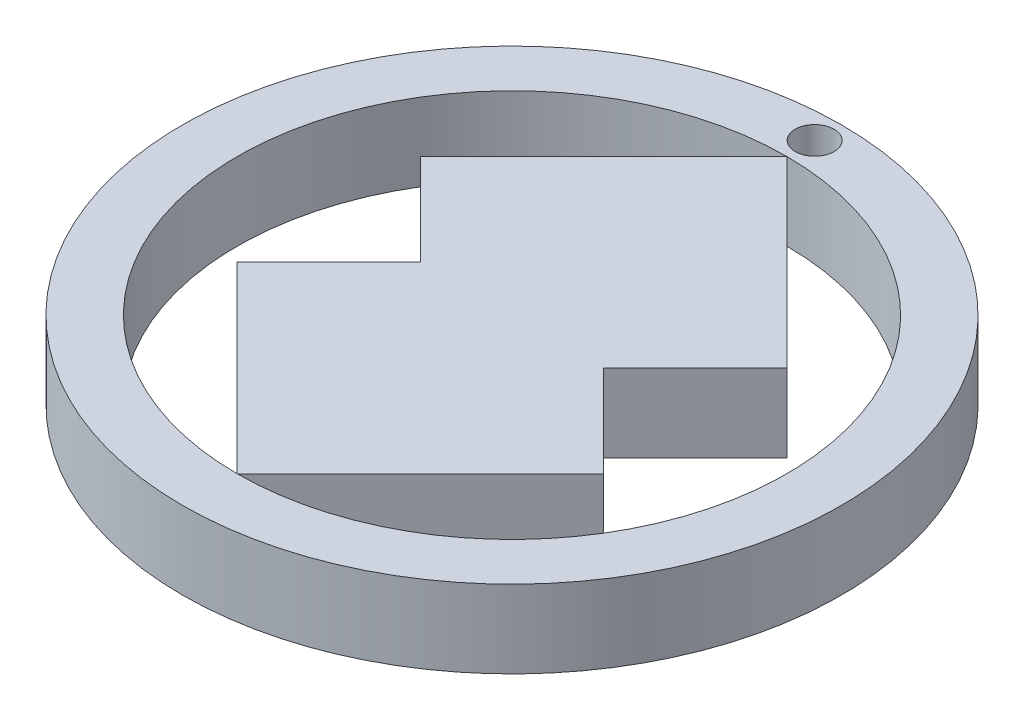
ISO-10303-21;
HEADER;
FILE_DESCRIPTION(('STEP AP214'),'2;1');
FILE_NAME('part.step','',(''),(''),'','','');
FILE_SCHEMA(('AUTOMOTIVE_DESIGN { 1 0 10303 214 1 1 1 1 }'));
ENDSEC;
DATA;
#1=APPLICATION_CONTEXT('core data for automotive mechanical design processes');
#2=APPLICATION_PROTOCOL_DEFINITION('international standard','automotive_design',2000,#1);
#3=PRODUCT_CONTEXT('',#1,'mechanical');
#4=PRODUCT('Part','Part','',(#3));
#5=PRODUCT_RELATED_PRODUCT_CATEGORY('part','',(#4));
#6=PRODUCT_DEFINITION_FORMATION('','',#4);
#7=PRODUCT_DEFINITION_CONTEXT('part definition',#1,'design');
#8=PRODUCT_DEFINITION('design','',#6,#7);
#9=PRODUCT_DEFINITION_SHAPE('','',#8);
#10=(LENGTH_UNIT() NAMED_UNIT(*) SI_UNIT(.MILLI.,.METRE.));
#11=(NAMED_UNIT(*) PLANE_ANGLE_UNIT() SI_UNIT($,.RADIAN.));
#12=(NAMED_UNIT(*) SI_UNIT($,.STERADIAN.) SOLID_ANGLE_UNIT());
#13=UNCERTAINTY_MEASURE_WITH_UNIT(LENGTH_MEASURE(1.E-05),#10,'distance_accuracy_value','');
#14=(GEOMETRIC_REPRESENTATION_CONTEXT(3) GLOBAL_UNCERTAINTY_ASSIGNED_CONTEXT((#13)) GLOBAL_UNIT_ASSIGNED_CONTEXT((#10,
#11,#12)) REPRESENTATION_CONTEXT('',''));
#15=CARTESIAN_POINT('',(0.,0.,0.));
#16=DIRECTION('',(0.,0.,1.));
#17=DIRECTION('',(1.,0.,0.));
#18=AXIS2_PLACEMENT_3D('',#15,#16,#17);
#19=CARTESIAN_POINT('',(0.,-71.9551489016206,-7.07106781186547));
#20=DIRECTION('',(0.,1.,0.));
#21=DIRECTION('',(0.,0.,1.));
#22=AXIS2_PLACEMENT_3D('',#19,#20,#21);
#23=CYLINDRICAL_SURFACE('',#22,25.4399868648118);
#24=CARTESIAN_POINT('',(0.,0.,-7.07106781186547));
#25=DIRECTION('',(0.,1.,0.));
#26=DIRECTION('',(0.,0.,1.));
#27=AXIS2_PLACEMENT_3D('',#24,#25,#26);
#28=CIRCLE('',#27,25.4399868648118);
#29=CARTESIAN_POINT('',(0.,0.,18.3689190529464));
#30=VERTEX_POINT('',#29);
#31=EDGE_CURVE('E11',#30,#30,#28,.F.);
#32=ORIENTED_EDGE('',*,*,#31,.F.);
#33=EDGE_LOOP('',(#32));
#34=FACE_BOUND('',#33,.T.);
#35=CARTESIAN_POINT('',(0.,6.,-7.07106781186547));
#36=DIRECTION('',(0.,1.,0.));
#37=DIRECTION('',(0.,0.,1.));
#38=AXIS2_PLACEMENT_3D('',#35,#36,#37);
#39=CIRCLE('',#38,25.4399868648118);
#40=CARTESIAN_POINT('',(0.,6.,18.3689190529464));
#41=VERTEX_POINT('',#40);
#42=EDGE_CURVE('E56',#41,#41,#39,.T.);
#43=ORIENTED_EDGE('',*,*,#42,.F.);
#44=EDGE_LOOP('',(#43));
#45=FACE_BOUND('',#44,.T.);
#46=ADVANCED_FACE('F45',(#34,#45),#23,.T.);
#47=CARTESIAN_POINT('',(0.,6.,-7.07106781186547));
#48=DIRECTION('',(0.,1.,0.));
#49=DIRECTION('',(0.,0.,1.));
#50=AXIS2_PLACEMENT_3D('',#47,#48,#49);
#51=PLANE('',#50);
#52=CARTESIAN_POINT('',(0.,6.,-30.4325096804757));
#53=DIRECTION('',(0.,1.,0.));
#54=DIRECTION('',(0.,0.,1.));
#55=AXIS2_PLACEMENT_3D('',#52,#53,#54);
#56=CIRCLE('',#55,1.5);
#57=CARTESIAN_POINT('',(0.,6.,-28.9325096804757));
#58=VERTEX_POINT('',#57);
#59=EDGE_CURVE('E59',#58,#58,#56,.T.);
#60=ORIENTED_EDGE('',*,*,#59,.F.);
#61=EDGE_LOOP('',(#60));
#62=FACE_BOUND('',#61,.T.);
#63=CARTESIAN_POINT('',(0.,6.,-7.07106781186547));
#64=DIRECTION('',(0.,1.,0.));
#65=DIRECTION('',(0.,0.,1.));
#66=AXIS2_PLACEMENT_3D('',#63,#64,#65);
#67=CIRCLE('',#66,21.2132034355963);
#68=CARTESIAN_POINT('',(0.,6.,14.1421356237308));
#69=VERTEX_POINT('',#68);
#70=EDGE_CURVE('E61',#69,#69,#67,.T.);
#71=ORIENTED_EDGE('',*,*,#70,.F.);
#72=EDGE_LOOP('',(#71));
#73=FACE_BOUND('',#72,.T.);
#74=ORIENTED_EDGE('',*,*,#42,.T.);
#75=EDGE_LOOP('',(#74));
#76=FACE_BOUND('',#75,.T.);
#77=ADVANCED_FACE('F67',(#62,#73,#76),#51,.T.);
#78=CARTESIAN_POINT('',(0.,-71.9551489016206,-7.07106781186547));
#79=DIRECTION('',(0.,1.,0.));
#80=DIRECTION('',(0.,0.,1.));
#81=AXIS2_PLACEMENT_3D('',#78,#79,#80);
#82=CYLINDRICAL_SURFACE('',#81,21.2132034355963);
#83=CARTESIAN_POINT('',(0.,0.,-7.07106781186547));
#84=DIRECTION('',(0.,1.,0.));
#85=DIRECTION('',(0.,0.,1.));
#86=AXIS2_PLACEMENT_3D('',#83,#84,#85);
#87=CIRCLE('',#86,21.2132034355963);
#88=CARTESIAN_POINT('',(0.,0.,14.1421356237308));
#89=VERTEX_POINT('',#88);
#90=EDGE_CURVE('E48',#89,#89,#87,.F.);
#91=ORIENTED_EDGE('',*,*,#90,.T.);
#92=EDGE_LOOP('',(#91));
#93=FACE_BOUND('',#92,.T.);
#94=ORIENTED_EDGE('',*,*,#70,.T.);
#95=EDGE_LOOP('',(#94));
#96=FACE_BOUND('',#95,.T.);
#97=ADVANCED_FACE('F74',(#93,#96),#82,.F.);
#98=CARTESIAN_POINT('',(0.,0.,0.));
#99=DIRECTION('',(0.,1.,0.));
#100=DIRECTION('',(0.,0.,1.));
#101=AXIS2_PLACEMENT_3D('',#98,#99,#100);
#102=PLANE('',#101);
#103=CARTESIAN_POINT('',(0.,0.,-30.4325096804757));
#104=DIRECTION('',(0.,1.,0.));
#105=DIRECTION('',(0.,0.,1.));
#106=AXIS2_PLACEMENT_3D('',#103,#104,#105);
#107=CIRCLE('',#106,1.5);
#108=CARTESIAN_POINT('',(0.,0.,-28.9325096804757));
#109=VERTEX_POINT('',#108);
#110=EDGE_CURVE('E63',#109,#109,#107,.T.);
#111=ORIENTED_EDGE('',*,*,#110,.T.);
#112=EDGE_LOOP('',(#111));
#113=FACE_BOUND('',#112,.T.);
#114=ORIENTED_EDGE('',*,*,#31,.T.);
#115=EDGE_LOOP('',(#114));
#116=FACE_BOUND('',#115,.T.);
#117=ORIENTED_EDGE('',*,*,#90,.F.);
#118=EDGE_LOOP('',(#117));
#119=FACE_BOUND('',#118,.T.);
#120=ADVANCED_FACE('F79',(#113,#116,#119),#102,.F.);
#121=CARTESIAN_POINT('',(0.,0.,-30.4325096804757));
#122=DIRECTION('',(0.,1.,0.));
#123=DIRECTION('',(0.,0.,1.));
#124=AXIS2_PLACEMENT_3D('',#121,#122,#123);
#125=CYLINDRICAL_SURFACE('',#124,1.5);
#126=ORIENTED_EDGE('',*,*,#110,.F.);
#127=EDGE_LOOP('',(#126));
#128=FACE_BOUND('',#127,.T.);
#129=ORIENTED_EDGE('',*,*,#59,.T.);
#130=EDGE_LOOP('',(#129));
#131=FACE_BOUND('',#130,.T.);
#132=ADVANCED_FACE('F87',(#128,#131),#125,.F.);
#133=CLOSED_SHELL('',(#46,#77,#97,#120,#132));
#134=MANIFOLD_SOLID_BREP('B2',#133);
#135=CARTESIAN_POINT('',(-7.0710678118655,6.,-7.07106781186547));
#136=DIRECTION('',(0.707106781186549,0.,0.707106781186545));
#137=DIRECTION('',(0.707106781186546,0.,-0.707106781186549));
#138=AXIS2_PLACEMENT_3D('',#135,#136,#137);
#139=PLANE('',#138);
#140=DIRECTION('',(-0.707106781186546,0.,0.707106781186549));
#141=VECTOR('',#140,1.);
#142=CARTESIAN_POINT('',(-7.0710678118655,0.,-7.07106781186547));
#143=LINE('',#142,#141);
#144=CARTESIAN_POINT('',(-7.0710678118655,0.,-7.07106781186547));
#145=VERTEX_POINT('',#144);
#146=CARTESIAN_POINT('',(-14.142135623731,0.,1.13715133352939E-13));
#147=VERTEX_POINT('',#146);
#148=EDGE_CURVE('E234',#145,#147,#143,.T.);
#149=ORIENTED_EDGE('',*,*,#148,.T.);
#150=DIRECTION('',(0.,-1.,0.));
#151=VECTOR('',#150,1.);
#152=CARTESIAN_POINT('',(-14.142135623731,6.,1.13715133352939E-13));
#153=LINE('',#152,#151);
#154=CARTESIAN_POINT('',(-14.142135623731,6.,1.13715133352939E-13));
#155=VERTEX_POINT('',#154);
#156=EDGE_CURVE('E43',#155,#147,#153,.T.);
#157=ORIENTED_EDGE('',*,*,#156,.F.);
#158=DIRECTION('',(-0.707106781186546,0.,0.707106781186549));
#159=VECTOR('',#158,1.);
#160=CARTESIAN_POINT('',(-7.0710678118655,6.,-7.07106781186547));
#161=LINE('',#160,#159);
#162=CARTESIAN_POINT('',(-7.0710678118655,6.,-7.07106781186547));
#163=VERTEX_POINT('',#162);
#164=EDGE_CURVE('E248',#163,#155,#161,.T.);
#165=ORIENTED_EDGE('',*,*,#164,.F.);
#166=DIRECTION('',(0.,-1.,0.));
#167=VECTOR('',#166,1.);
#168=CARTESIAN_POINT('',(-7.0710678118655,6.,-7.07106781186547));
#169=LINE('',#168,#167);
#170=EDGE_CURVE('E230',#163,#145,#169,.T.);
#171=ORIENTED_EDGE('',*,*,#170,.T.);
#172=EDGE_LOOP('',(#149,#157,#165,#171));
#173=FACE_BOUND('',#172,.T.);
#174=ADVANCED_FACE('F138',(#173),#139,.F.);
#175=CARTESIAN_POINT('',(-14.142135623731,6.,1.13715133352939E-13));
#176=DIRECTION('',(0.707106781186546,0.,-0.707106781186549));
#177=DIRECTION('',(-0.707106781186549,0.,-0.707106781186546));
#178=AXIS2_PLACEMENT_3D('',#175,#176,#177);
#179=PLANE('',#178);
#180=DIRECTION('',(0.707106781186549,0.,0.707106781186546));
#181=VECTOR('',#180,1.);
#182=CARTESIAN_POINT('',(-14.142135623731,0.,1.13715133352939E-13));
#183=LINE('',#182,#181);
#184=CARTESIAN_POINT('',(0.,0.,14.142135623731));
#185=VERTEX_POINT('',#184);
#186=EDGE_CURVE('E237',#147,#185,#183,.T.);
#187=ORIENTED_EDGE('',*,*,#186,.T.);
#188=DIRECTION('',(0.,-1.,0.));
#189=VECTOR('',#188,1.);
#190=CARTESIAN_POINT('',(0.,6.,14.142135623731));
#191=LINE('',#190,#189);
#192=CARTESIAN_POINT('',(0.,6.,14.142135623731));
#193=VERTEX_POINT('',#192);
#194=EDGE_CURVE('E146',#193,#185,#191,.T.);
#195=ORIENTED_EDGE('',*,*,#194,.F.);
#196=DIRECTION('',(0.707106781186549,0.,0.707106781186546));
#197=VECTOR('',#196,1.);
#198=CARTESIAN_POINT('',(-14.142135623731,6.,1.13715133352939E-13));
#199=LINE('',#198,#197);
#200=EDGE_CURVE('E197',#155,#193,#199,.T.);
#201=ORIENTED_EDGE('',*,*,#200,.F.);
#202=ORIENTED_EDGE('',*,*,#156,.T.);
#203=EDGE_LOOP('',(#187,#195,#201,#202));
#204=FACE_BOUND('',#203,.T.);
#205=ADVANCED_FACE('F283',(#204),#179,.F.);
#206=CARTESIAN_POINT('',(14.1421356237307,6.,2.00540094161142E-13));
#207=DIRECTION('',(-0.707106781186549,0.,-0.707106781186546));
#208=DIRECTION('',(-0.707106781186546,0.,0.707106781186549));
#209=AXIS2_PLACEMENT_3D('',#206,#207,#208);
#210=PLANE('',#209);
#211=DIRECTION('',(0.707106781186546,0.,-0.707106781186549));
#212=VECTOR('',#211,1.);
#213=CARTESIAN_POINT('',(14.1421356237307,0.,2.00540094161142E-13));
#214=LINE('',#213,#212);
#215=CARTESIAN_POINT('',(14.1421356237307,0.,2.00540094161142E-13));
#216=VERTEX_POINT('',#215);
#217=EDGE_CURVE('E239',#185,#216,#214,.T.);
#218=ORIENTED_EDGE('',*,*,#217,.T.);
#219=DIRECTION('',(0.,-1.,0.));
#220=VECTOR('',#219,1.);
#221=CARTESIAN_POINT('',(14.1421356237307,6.,2.00540094161142E-13));
#222=LINE('',#221,#220);
#223=CARTESIAN_POINT('',(14.1421356237307,6.,2.00540094161142E-13));
#224=VERTEX_POINT('',#223);
#225=EDGE_CURVE('E255',#224,#216,#222,.T.);
#226=ORIENTED_EDGE('',*,*,#225,.F.);
#227=DIRECTION('',(0.707106781186546,0.,-0.707106781186549));
#228=VECTOR('',#227,1.);
#229=CARTESIAN_POINT('',(14.1421356237307,6.,2.00540094161142E-13));
#230=LINE('',#229,#228);
#231=EDGE_CURVE('E263',#193,#224,#230,.T.);
#232=ORIENTED_EDGE('',*,*,#231,.F.);
#233=ORIENTED_EDGE('',*,*,#194,.T.);
#234=EDGE_LOOP('',(#218,#226,#232,#233));
#235=FACE_BOUND('',#234,.T.);
#236=ADVANCED_FACE('F261',(#235),#210,.F.);
#237=CARTESIAN_POINT('',(7.07106781186515,6.,-7.0710678118653));
#238=DIRECTION('',(-0.707106781186545,0.,0.707106781186549));
#239=DIRECTION('',(0.707106781186549,0.,0.707106781186546));
#240=AXIS2_PLACEMENT_3D('',#237,#238,#239);
#241=PLANE('',#240);
#242=DIRECTION('',(-0.707106781186549,0.,-0.707106781186546));
#243=VECTOR('',#242,1.);
#244=CARTESIAN_POINT('',(7.07106781186515,0.,-7.0710678118653));
#245=LINE('',#244,#243);
#246=CARTESIAN_POINT('',(7.07106781186515,0.,-7.0710678118653));
#247=VERTEX_POINT('',#246);
#248=EDGE_CURVE('E241',#216,#247,#245,.T.);
#249=ORIENTED_EDGE('',*,*,#248,.T.);
#250=DIRECTION('',(0.,-1.,0.));
#251=VECTOR('',#250,1.);
#252=CARTESIAN_POINT('',(7.07106781186515,6.,-7.0710678118653));
#253=LINE('',#252,#251);
#254=CARTESIAN_POINT('',(7.07106781186515,6.,-7.0710678118653));
#255=VERTEX_POINT('',#254);
#256=EDGE_CURVE('E252',#255,#247,#253,.T.);
#257=ORIENTED_EDGE('',*,*,#256,.F.);
#258=DIRECTION('',(-0.707106781186549,0.,-0.707106781186546));
#259=VECTOR('',#258,1.);
#260=CARTESIAN_POINT('',(7.07106781186515,6.,-7.0710678118653));
#261=LINE('',#260,#259);
#262=EDGE_CURVE('E275',#224,#255,#261,.T.);
#263=ORIENTED_EDGE('',*,*,#262,.F.);
#264=ORIENTED_EDGE('',*,*,#225,.T.);
#265=EDGE_LOOP('',(#249,#257,#263,#264));
#266=FACE_BOUND('',#265,.T.);
#267=ADVANCED_FACE('F271',(#266),#241,.F.);
#268=CARTESIAN_POINT('',(7.07106781186515,6.,-7.0710678118653));
#269=DIRECTION('',(-0.707106781186549,0.,-0.707106781186545));
#270=DIRECTION('',(-0.707106781186546,0.,0.70710678118655));
#271=AXIS2_PLACEMENT_3D('',#268,#269,#270);
#272=PLANE('',#271);
#273=DIRECTION('',(0.707106781186546,0.,-0.70710678118655));
#274=VECTOR('',#273,1.);
#275=CARTESIAN_POINT('',(7.07106781186515,0.,-7.0710678118653));
#276=LINE('',#275,#274);
#277=CARTESIAN_POINT('',(14.1421356237307,0.,-14.1421356237308));
#278=VERTEX_POINT('',#277);
#279=EDGE_CURVE('E243',#247,#278,#276,.T.);
#280=ORIENTED_EDGE('',*,*,#279,.T.);
#281=DIRECTION('',(0.,-1.,0.));
#282=VECTOR('',#281,1.);
#283=CARTESIAN_POINT('',(14.1421356237307,6.,-14.1421356237308));
#284=LINE('',#283,#282);
#285=CARTESIAN_POINT('',(14.1421356237307,6.,-14.1421356237308));
#286=VERTEX_POINT('',#285);
#287=EDGE_CURVE('E225',#286,#278,#284,.T.);
#288=ORIENTED_EDGE('',*,*,#287,.F.);
#289=DIRECTION('',(0.707106781186546,0.,-0.70710678118655));
#290=VECTOR('',#289,1.);
#291=CARTESIAN_POINT('',(7.07106781186515,6.,-7.0710678118653));
#292=LINE('',#291,#290);
#293=EDGE_CURVE('E216',#255,#286,#292,.T.);
#294=ORIENTED_EDGE('',*,*,#293,.F.);
#295=ORIENTED_EDGE('',*,*,#256,.T.);
#296=EDGE_LOOP('',(#280,#288,#294,#295));
#297=FACE_BOUND('',#296,.T.);
#298=ADVANCED_FACE('F274',(#297),#272,.F.);
#299=CARTESIAN_POINT('',(-3.31612292499784E-13,6.,-28.2842712474618));
#300=DIRECTION('',(-0.707106781186546,0.,0.707106781186549));
#301=DIRECTION('',(0.707106781186549,0.,0.707106781186546));
#302=AXIS2_PLACEMENT_3D('',#299,#300,#301);
#303=PLANE('',#302);
#304=DIRECTION('',(-0.707106781186549,0.,-0.707106781186546));
#305=VECTOR('',#304,1.);
#306=CARTESIAN_POINT('',(-3.31612292499784E-13,0.,-28.2842712474618));
#307=LINE('',#306,#305);
#308=CARTESIAN_POINT('',(-3.31612292499784E-13,0.,-28.2842712474618));
#309=VERTEX_POINT('',#308);
#310=EDGE_CURVE('E224',#278,#309,#307,.T.);
#311=ORIENTED_EDGE('',*,*,#310,.T.);
#312=DIRECTION('',(0.,-1.,0.));
#313=VECTOR('',#312,1.);
#314=CARTESIAN_POINT('',(-3.31612292499784E-13,6.,-28.2842712474618));
#315=LINE('',#314,#313);
#316=CARTESIAN_POINT('',(-3.31612292499784E-13,6.,-28.2842712474618));
#317=VERTEX_POINT('',#316);
#318=EDGE_CURVE('E221',#317,#309,#315,.T.);
#319=ORIENTED_EDGE('',*,*,#318,.F.);
#320=DIRECTION('',(-0.707106781186549,0.,-0.707106781186546));
#321=VECTOR('',#320,1.);
#322=CARTESIAN_POINT('',(-3.31612292499784E-13,6.,-28.2842712474618));
#323=LINE('',#322,#321);
#324=EDGE_CURVE('E210',#286,#317,#323,.T.);
#325=ORIENTED_EDGE('',*,*,#324,.F.);
#326=ORIENTED_EDGE('',*,*,#287,.T.);
#327=EDGE_LOOP('',(#311,#319,#325,#326));
#328=FACE_BOUND('',#327,.T.);
#329=ADVANCED_FACE('F222',(#328),#303,.F.);
#330=CARTESIAN_POINT('',(-14.142135623731,6.,-14.142135623731));
#331=DIRECTION('',(0.707106781186549,0.,0.707106781186546));
#332=DIRECTION('',(0.707106781186546,0.,-0.707106781186549));
#333=AXIS2_PLACEMENT_3D('',#330,#331,#332);
#334=PLANE('',#333);
#335=DIRECTION('',(-0.707106781186546,0.,0.70710678118655));
#336=VECTOR('',#335,1.);
#337=CARTESIAN_POINT('',(-14.142135623731,0.,-14.142135623731));
#338=LINE('',#337,#336);
#339=CARTESIAN_POINT('',(-14.142135623731,0.,-14.142135623731));
#340=VERTEX_POINT('',#339);
#341=EDGE_CURVE('E183',#309,#340,#338,.T.);
#342=ORIENTED_EDGE('',*,*,#341,.T.);
#343=DIRECTION('',(0.,-1.,0.));
#344=VECTOR('',#343,1.);
#345=CARTESIAN_POINT('',(-14.142135623731,6.,-14.142135623731));
#346=LINE('',#345,#344);
#347=CARTESIAN_POINT('',(-14.142135623731,6.,-14.142135623731));
#348=VERTEX_POINT('',#347);
#349=EDGE_CURVE('E226',#348,#340,#346,.T.);
#350=ORIENTED_EDGE('',*,*,#349,.F.);
#351=DIRECTION('',(-0.707106781186546,0.,0.70710678118655));
#352=VECTOR('',#351,1.);
#353=CARTESIAN_POINT('',(-14.142135623731,6.,-14.142135623731));
#354=LINE('',#353,#352);
#355=EDGE_CURVE('E214',#317,#348,#354,.T.);
#356=ORIENTED_EDGE('',*,*,#355,.F.);
#357=ORIENTED_EDGE('',*,*,#318,.T.);
#358=EDGE_LOOP('',(#342,#350,#356,#357));
#359=FACE_BOUND('',#358,.T.);
#360=ADVANCED_FACE('F228',(#359),#334,.F.);
#361=CARTESIAN_POINT('',(-14.142135623731,6.,-14.142135623731));
#362=DIRECTION('',(0.707106781186546,0.,-0.707106781186549));
#363=DIRECTION('',(-0.707106781186549,0.,-0.707106781186546));
#364=AXIS2_PLACEMENT_3D('',#361,#362,#363);
#365=PLANE('',#364);
#366=DIRECTION('',(0.707106781186549,0.,0.707106781186546));
#367=VECTOR('',#366,1.);
#368=CARTESIAN_POINT('',(-14.142135623731,0.,-14.142135623731));
#369=LINE('',#368,#367);
#370=EDGE_CURVE('E189',#340,#145,#369,.T.);
#371=ORIENTED_EDGE('',*,*,#370,.T.);
#372=ORIENTED_EDGE('',*,*,#170,.F.);
#373=DIRECTION('',(0.707106781186549,0.,0.707106781186546));
#374=VECTOR('',#373,1.);
#375=CARTESIAN_POINT('',(-14.142135623731,6.,-14.142135623731));
#376=LINE('',#375,#374);
#377=EDGE_CURVE('E154',#348,#163,#376,.T.);
#378=ORIENTED_EDGE('',*,*,#377,.F.);
#379=ORIENTED_EDGE('',*,*,#349,.T.);
#380=EDGE_LOOP('',(#371,#372,#378,#379));
#381=FACE_BOUND('',#380,.T.);
#382=ADVANCED_FACE('F299',(#381),#365,.F.);
#383=CARTESIAN_POINT('',(0.,6.,0.));
#384=DIRECTION('',(0.,1.,0.));
#385=DIRECTION('',(0.,0.,1.));
#386=AXIS2_PLACEMENT_3D('',#383,#384,#385);
#387=PLANE('',#386);
#388=ORIENTED_EDGE('',*,*,#164,.T.);
#389=ORIENTED_EDGE('',*,*,#200,.T.);
#390=ORIENTED_EDGE('',*,*,#231,.T.);
#391=ORIENTED_EDGE('',*,*,#262,.T.);
#392=ORIENTED_EDGE('',*,*,#293,.T.);
#393=ORIENTED_EDGE('',*,*,#324,.T.);
#394=ORIENTED_EDGE('',*,*,#355,.T.);
#395=ORIENTED_EDGE('',*,*,#377,.T.);
#396=EDGE_LOOP('',(#388,#389,#390,#391,#392,#393,#394,#395));
#397=FACE_BOUND('',#396,.T.);
#398=ADVANCED_FACE('F212',(#397),#387,.T.);
#399=CARTESIAN_POINT('',(0.,0.,0.));
#400=DIRECTION('',(0.,1.,0.));
#401=DIRECTION('',(0.,0.,1.));
#402=AXIS2_PLACEMENT_3D('',#399,#400,#401);
#403=PLANE('',#402);
#404=ORIENTED_EDGE('',*,*,#148,.F.);
#405=ORIENTED_EDGE('',*,*,#370,.F.);
#406=ORIENTED_EDGE('',*,*,#341,.F.);
#407=ORIENTED_EDGE('',*,*,#310,.F.);
#408=ORIENTED_EDGE('',*,*,#279,.F.);
#409=ORIENTED_EDGE('',*,*,#248,.F.);
#410=ORIENTED_EDGE('',*,*,#217,.F.);
#411=ORIENTED_EDGE('',*,*,#186,.F.);
#412=EDGE_LOOP('',(#404,#405,#406,#407,#408,#409,#410,#411));
#413=FACE_BOUND('',#412,.T.);
#414=ADVANCED_FACE('F267',(#413),#403,.F.);
#415=CLOSED_SHELL('',(#174,#205,#236,#267,#298,#329,#360,#382,#398,#414));
#416=MANIFOLD_SOLID_BREP('B6',#415);
#417=ADVANCED_BREP_SHAPE_REPRESENTATION('',(#18,#134,#416),#14);
#418=SHAPE_DEFINITION_REPRESENTATION(#9,#417);
ENDSEC;
END-ISO-10303-21;
